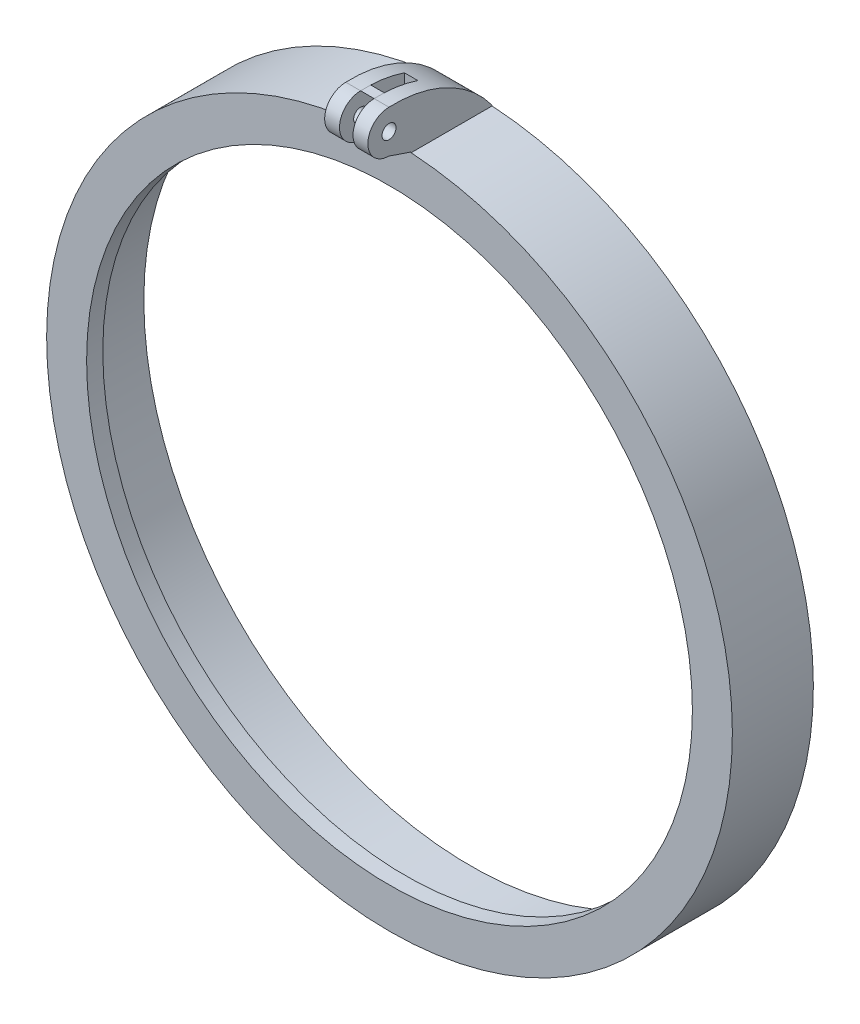
ISO-10303-21;
HEADER;
FILE_DESCRIPTION(('STEP AP214'),'2;1');
FILE_NAME('part.step','',(''),(''),'','','');
FILE_SCHEMA(('AUTOMOTIVE_DESIGN { 1 0 10303 214 1 1 1 1 }'));
ENDSEC;
DATA;
#1=APPLICATION_CONTEXT('core data for automotive mechanical design processes');
#2=APPLICATION_PROTOCOL_DEFINITION('international standard','automotive_design',2000,#1);
#3=PRODUCT_CONTEXT('',#1,'mechanical');
#4=PRODUCT('Part','Part','',(#3));
#5=PRODUCT_RELATED_PRODUCT_CATEGORY('part','',(#4));
#6=PRODUCT_DEFINITION_FORMATION('','',#4);
#7=PRODUCT_DEFINITION_CONTEXT('part definition',#1,'design');
#8=PRODUCT_DEFINITION('design','',#6,#7);
#9=PRODUCT_DEFINITION_SHAPE('','',#8);
#10=(LENGTH_UNIT() NAMED_UNIT(*) SI_UNIT(.MILLI.,.METRE.));
#11=(NAMED_UNIT(*) PLANE_ANGLE_UNIT() SI_UNIT($,.RADIAN.));
#12=(NAMED_UNIT(*) SI_UNIT($,.STERADIAN.) SOLID_ANGLE_UNIT());
#13=UNCERTAINTY_MEASURE_WITH_UNIT(LENGTH_MEASURE(1.E-05),#10,'distance_accuracy_value','');
#14=(GEOMETRIC_REPRESENTATION_CONTEXT(3) GLOBAL_UNCERTAINTY_ASSIGNED_CONTEXT((#13)) GLOBAL_UNIT_ASSIGNED_CONTEXT((#10,
#11,#12)) REPRESENTATION_CONTEXT('',''));
#15=CARTESIAN_POINT('',(0.,0.,0.));
#16=DIRECTION('',(0.,0.,1.));
#17=DIRECTION('',(1.,0.,0.));
#18=AXIS2_PLACEMENT_3D('',#15,#16,#17);
#19=CARTESIAN_POINT('',(-3.99999999999999,229.185888223784,-39.1843939049819));
#20=DIRECTION('',(1.,0.,0.));
#21=DIRECTION('',(0.,0.,-1.));
#22=AXIS2_PLACEMENT_3D('',#19,#20,#21);
#23=CYLINDRICAL_SURFACE('',#22,174.320859622004);
#24=CARTESIAN_POINT('',(-1.24999999999999,229.185888223784,-39.1843939049819));
#25=DIRECTION('',(-1.,0.,0.));
#26=DIRECTION('',(0.,0.,1.));
#27=AXIS2_PLACEMENT_3D('',#24,#25,#26);
#28=CIRCLE('',#27,174.320859622004);
#29=CARTESIAN_POINT('',(-1.24999999999999,64.8948795862415,19.0927592531248));
#30=VERTEX_POINT('',#29);
#31=CARTESIAN_POINT('',(-1.24999999999999,63.5,15.));
#32=VERTEX_POINT('',#31);
#33=EDGE_CURVE('E142',#30,#32,#28,.F.);
#34=ORIENTED_EDGE('',*,*,#33,.F.);
#35=DIRECTION('',(1.,0.,0.));
#36=VECTOR('',#35,1.);
#37=CARTESIAN_POINT('',(-3.99999999999999,64.8948795862415,19.0927592531248));
#38=LINE('',#37,#36);
#39=CARTESIAN_POINT('',(-3.99999999999999,64.8948795862415,19.0927592531248));
#40=VERTEX_POINT('',#39);
#41=EDGE_CURVE('E230',#40,#30,#38,.T.);
#42=ORIENTED_EDGE('',*,*,#41,.F.);
#43=CARTESIAN_POINT('',(-3.99999999999999,229.185888223784,-39.1843939049819));
#44=DIRECTION('',(1.,0.,0.));
#45=DIRECTION('',(0.,0.,-1.));
#46=AXIS2_PLACEMENT_3D('',#43,#44,#45);
#47=CIRCLE('',#46,174.320859622004);
#48=CARTESIAN_POINT('',(-3.99999999999999,63.5,15.));
#49=VERTEX_POINT('',#48);
#50=EDGE_CURVE('E225',#40,#49,#47,.T.);
#51=ORIENTED_EDGE('',*,*,#50,.T.);
#52=DIRECTION('',(-1.,0.,0.));
#53=VECTOR('',#52,1.);
#54=CARTESIAN_POINT('',(-3.99999999999999,63.5,15.));
#55=LINE('',#54,#53);
#56=EDGE_CURVE('E249',#32,#49,#55,.T.);
#57=ORIENTED_EDGE('',*,*,#56,.F.);
#58=EDGE_LOOP('',(#34,#42,#51,#57));
#59=FACE_BOUND('',#58,.T.);
#60=ADVANCED_FACE('F38',(#59),#23,.T.);
#61=CARTESIAN_POINT('',(-3.99999999999999,68.8116804407337,19.0927592531248));
#62=DIRECTION('',(1.,0.,0.));
#63=DIRECTION('',(0.,0.,-1.));
#64=AXIS2_PLACEMENT_3D('',#61,#62,#63);
#65=CYLINDRICAL_SURFACE('',#64,3.91680085449216);
#66=CARTESIAN_POINT('',(-1.24999999999999,68.8116804407337,19.0927592531248));
#67=DIRECTION('',(-1.,0.,0.));
#68=DIRECTION('',(0.,0.,1.));
#69=AXIS2_PLACEMENT_3D('',#66,#67,#68);
#70=CIRCLE('',#69,3.91680085449216);
#71=CARTESIAN_POINT('',(-1.24999999999999,72.7284812952258,19.0927592531248));
#72=VERTEX_POINT('',#71);
#73=EDGE_CURVE('E174',#72,#30,#70,.F.);
#74=ORIENTED_EDGE('',*,*,#73,.F.);
#75=DIRECTION('',(1.,0.,0.));
#76=VECTOR('',#75,1.);
#77=CARTESIAN_POINT('',(-3.99999999999999,72.7284812952258,19.0927592531248));
#78=LINE('',#77,#76);
#79=CARTESIAN_POINT('',(-3.99999999999999,72.7284812952258,19.0927592531248));
#80=VERTEX_POINT('',#79);
#81=EDGE_CURVE('E236',#80,#72,#78,.T.);
#82=ORIENTED_EDGE('',*,*,#81,.F.);
#83=CARTESIAN_POINT('',(-3.99999999999999,68.8116804407337,19.0927592531248));
#84=DIRECTION('',(1.,0.,0.));
#85=DIRECTION('',(0.,0.,-1.));
#86=AXIS2_PLACEMENT_3D('',#83,#84,#85);
#87=CIRCLE('',#86,3.91680085449216);
#88=EDGE_CURVE('E221',#80,#40,#87,.T.);
#89=ORIENTED_EDGE('',*,*,#88,.T.);
#90=ORIENTED_EDGE('',*,*,#41,.T.);
#91=EDGE_LOOP('',(#74,#82,#89,#90));
#92=FACE_BOUND('',#91,.T.);
#93=ADVANCED_FACE('F308',(#92),#65,.T.);
#94=CARTESIAN_POINT('',(-3.99999999999999,68.8116804407337,19.0927592531248));
#95=DIRECTION('',(1.,0.,0.));
#96=DIRECTION('',(0.,0.,-1.));
#97=AXIS2_PLACEMENT_3D('',#94,#95,#96);
#98=CYLINDRICAL_SURFACE('',#97,1.3);
#99=CARTESIAN_POINT('',(-1.24999999999999,68.8116804407337,19.0927592531248));
#100=DIRECTION('',(-1.,0.,0.));
#101=DIRECTION('',(0.,0.,1.));
#102=AXIS2_PLACEMENT_3D('',#99,#100,#101);
#103=CIRCLE('',#102,1.3);
#104=CARTESIAN_POINT('',(-1.24999999999999,68.8116804407337,20.3927592531248));
#105=VERTEX_POINT('',#104);
#106=EDGE_CURVE('E173',#105,#105,#103,.F.);
#107=ORIENTED_EDGE('',*,*,#106,.T.);
#108=EDGE_LOOP('',(#107));
#109=FACE_BOUND('',#108,.T.);
#110=CARTESIAN_POINT('',(-3.99999999999999,68.8116804407337,19.0927592531248));
#111=DIRECTION('',(1.,0.,0.));
#112=DIRECTION('',(0.,0.,-1.));
#113=AXIS2_PLACEMENT_3D('',#110,#111,#112);
#114=CIRCLE('',#113,1.3);
#115=CARTESIAN_POINT('',(-3.99999999999999,68.8116804407337,17.7927592531248));
#116=VERTEX_POINT('',#115);
#117=EDGE_CURVE('E213',#116,#116,#114,.T.);
#118=ORIENTED_EDGE('',*,*,#117,.F.);
#119=EDGE_LOOP('',(#118));
#120=FACE_BOUND('',#119,.T.);
#121=ADVANCED_FACE('F290',(#109,#120),#98,.F.);
#122=CARTESIAN_POINT('',(0.,0.,15.));
#123=DIRECTION('',(0.,0.,-1.));
#124=DIRECTION('',(-1.,0.,0.));
#125=AXIS2_PLACEMENT_3D('',#122,#123,#124);
#126=CYLINDRICAL_SURFACE('',#125,63.5);
#127=DIRECTION('',(0.,0.,-1.));
#128=VECTOR('',#127,1.);
#129=CARTESIAN_POINT('',(3.99999999999999,63.3738905228328,15.));
#130=LINE('',#129,#128);
#131=CARTESIAN_POINT('',(3.99999999999999,63.3738905228328,0.));
#132=VERTEX_POINT('',#131);
#133=CARTESIAN_POINT('',(3.99999999999999,63.3738905228328,15.));
#134=VERTEX_POINT('',#133);
#135=EDGE_CURVE('E186',#132,#134,#130,.F.);
#136=ORIENTED_EDGE('',*,*,#135,.T.);
#137=CARTESIAN_POINT('',(0.,0.,15.));
#138=DIRECTION('',(0.,0.,1.));
#139=DIRECTION('',(1.,0.,0.));
#140=AXIS2_PLACEMENT_3D('',#137,#138,#139);
#141=CIRCLE('',#140,63.5);
#142=CARTESIAN_POINT('',(-3.99999999999999,63.3738905228328,15.));
#143=VERTEX_POINT('',#142);
#144=EDGE_CURVE('E47',#143,#134,#141,.T.);
#145=ORIENTED_EDGE('',*,*,#144,.F.);
#146=DIRECTION('',(0.,0.,-1.));
#147=VECTOR('',#146,1.);
#148=CARTESIAN_POINT('',(-3.99999999999999,63.3738905228328,15.));
#149=LINE('',#148,#147);
#150=CARTESIAN_POINT('',(-3.99999999999999,63.3738905228328,0.));
#151=VERTEX_POINT('',#150);
#152=EDGE_CURVE('E241',#143,#151,#149,.T.);
#153=ORIENTED_EDGE('',*,*,#152,.T.);
#154=CARTESIAN_POINT('',(0.,0.,0.));
#155=DIRECTION('',(0.,0.,1.));
#156=DIRECTION('',(1.,0.,0.));
#157=AXIS2_PLACEMENT_3D('',#154,#155,#156);
#158=CIRCLE('',#157,63.5);
#159=EDGE_CURVE('E270',#151,#132,#158,.T.);
#160=ORIENTED_EDGE('',*,*,#159,.T.);
#161=EDGE_LOOP('',(#136,#145,#153,#160));
#162=FACE_BOUND('',#161,.T.);
#163=ADVANCED_FACE('F40',(#162),#126,.T.);
#164=CARTESIAN_POINT('',(0.,0.,15.));
#165=DIRECTION('',(0.,0.,1.));
#166=DIRECTION('',(1.,0.,0.));
#167=AXIS2_PLACEMENT_3D('',#164,#165,#166);
#168=PLANE('',#167);
#169=CARTESIAN_POINT('',(0.,0.,15.));
#170=DIRECTION('',(0.,0.,1.));
#171=DIRECTION('',(1.,0.,0.));
#172=AXIS2_PLACEMENT_3D('',#169,#170,#171);
#173=CIRCLE('',#172,56.097029569979);
#174=CARTESIAN_POINT('',(56.097029569979,0.,15.));
#175=VERTEX_POINT('',#174);
#176=EDGE_CURVE('E265',#175,#175,#173,.T.);
#177=ORIENTED_EDGE('',*,*,#176,.F.);
#178=EDGE_LOOP('',(#177));
#179=FACE_BOUND('',#178,.T.);
#180=ORIENTED_EDGE('',*,*,#144,.T.);
#181=DIRECTION('',(0.,1.,0.));
#182=VECTOR('',#181,1.);
#183=CARTESIAN_POINT('',(3.99999999999999,-63.501,15.));
#184=LINE('',#183,#182);
#185=CARTESIAN_POINT('',(3.99999999999999,63.5,15.));
#186=VERTEX_POINT('',#185);
#187=EDGE_CURVE('E185',#134,#186,#184,.T.);
#188=ORIENTED_EDGE('',*,*,#187,.T.);
#189=CARTESIAN_POINT('',(1.25000000000001,63.5,15.));
#190=VERTEX_POINT('',#189);
#191=EDGE_CURVE('E250',#186,#190,#55,.T.);
#192=ORIENTED_EDGE('',*,*,#191,.T.);
#193=EDGE_CURVE('E255',#190,#32,#55,.T.);
#194=ORIENTED_EDGE('',*,*,#193,.T.);
#195=ORIENTED_EDGE('',*,*,#56,.T.);
#196=DIRECTION('',(0.,1.,0.));
#197=VECTOR('',#196,1.);
#198=CARTESIAN_POINT('',(-3.99999999999999,-63.501,15.));
#199=LINE('',#198,#197);
#200=EDGE_CURVE('E254',#143,#49,#199,.T.);
#201=ORIENTED_EDGE('',*,*,#200,.F.);
#202=EDGE_LOOP('',(#180,#188,#192,#194,#195,#201));
#203=FACE_BOUND('',#202,.T.);
#204=ADVANCED_FACE('F335',(#179,#203),#168,.T.);
#205=CARTESIAN_POINT('',(0.,0.,0.));
#206=DIRECTION('',(0.,0.,1.));
#207=DIRECTION('',(1.,0.,0.));
#208=AXIS2_PLACEMENT_3D('',#205,#206,#207);
#209=PLANE('',#208);
#210=CARTESIAN_POINT('',(0.,0.,0.));
#211=DIRECTION('',(0.,0.,1.));
#212=DIRECTION('',(1.,0.,0.));
#213=AXIS2_PLACEMENT_3D('',#210,#211,#212);
#214=CIRCLE('',#213,60.5);
#215=CARTESIAN_POINT('',(60.5,0.,0.));
#216=VERTEX_POINT('',#215);
#217=EDGE_CURVE('E271',#216,#216,#214,.T.);
#218=ORIENTED_EDGE('',*,*,#217,.T.);
#219=EDGE_LOOP('',(#218));
#220=FACE_BOUND('',#219,.T.);
#221=ORIENTED_EDGE('',*,*,#159,.F.);
#222=DIRECTION('',(0.,1.,0.));
#223=VECTOR('',#222,1.);
#224=CARTESIAN_POINT('',(-3.99999999999999,-63.501,0.));
#225=LINE('',#224,#223);
#226=CARTESIAN_POINT('',(-3.99999999999999,63.5,0.));
#227=VERTEX_POINT('',#226);
#228=EDGE_CURVE('E246',#151,#227,#225,.T.);
#229=ORIENTED_EDGE('',*,*,#228,.T.);
#230=DIRECTION('',(1.,0.,0.));
#231=VECTOR('',#230,1.);
#232=CARTESIAN_POINT('',(-3.99999999999999,63.5,0.));
#233=LINE('',#232,#231);
#234=CARTESIAN_POINT('',(3.99999999999999,63.5,0.));
#235=VERTEX_POINT('',#234);
#236=EDGE_CURVE('E234',#227,#235,#233,.T.);
#237=ORIENTED_EDGE('',*,*,#236,.T.);
#238=DIRECTION('',(0.,1.,0.));
#239=VECTOR('',#238,1.);
#240=CARTESIAN_POINT('',(3.99999999999999,-63.501,0.));
#241=LINE('',#240,#239);
#242=EDGE_CURVE('E191',#132,#235,#241,.T.);
#243=ORIENTED_EDGE('',*,*,#242,.F.);
#244=EDGE_LOOP('',(#221,#229,#237,#243));
#245=FACE_BOUND('',#244,.T.);
#246=ADVANCED_FACE('F363',(#220,#245),#209,.F.);
#247=CARTESIAN_POINT('',(0.,0.,15.));
#248=DIRECTION('',(0.,0.,-1.));
#249=DIRECTION('',(-1.,0.,0.));
#250=AXIS2_PLACEMENT_3D('',#247,#248,#249);
#251=CYLINDRICAL_SURFACE('',#250,60.5);
#252=CARTESIAN_POINT('',(0.,0.,12.));
#253=DIRECTION('',(0.,0.,1.));
#254=DIRECTION('',(1.,0.,0.));
#255=AXIS2_PLACEMENT_3D('',#252,#253,#254);
#256=CIRCLE('',#255,60.5);
#257=CARTESIAN_POINT('',(60.5,0.,12.));
#258=VERTEX_POINT('',#257);
#259=EDGE_CURVE('E266',#258,#258,#256,.T.);
#260=ORIENTED_EDGE('',*,*,#259,.T.);
#261=EDGE_LOOP('',(#260));
#262=FACE_BOUND('',#261,.T.);
#263=ORIENTED_EDGE('',*,*,#217,.F.);
#264=EDGE_LOOP('',(#263));
#265=FACE_BOUND('',#264,.T.);
#266=ADVANCED_FACE('F365',(#262,#265),#251,.F.);
#267=CARTESIAN_POINT('',(0.,0.,12.));
#268=DIRECTION('',(0.,0.,1.));
#269=DIRECTION('',(1.,0.,0.));
#270=AXIS2_PLACEMENT_3D('',#267,#268,#269);
#271=PLANE('',#270);
#272=CARTESIAN_POINT('',(0.,0.,12.));
#273=DIRECTION('',(0.,0.,-1.));
#274=DIRECTION('',(-1.,0.,0.));
#275=AXIS2_PLACEMENT_3D('',#272,#273,#274);
#276=CIRCLE('',#275,56.097029569979);
#277=CARTESIAN_POINT('',(-56.097029569979,0.,12.));
#278=VERTEX_POINT('',#277);
#279=EDGE_CURVE('E245',#278,#278,#276,.T.);
#280=ORIENTED_EDGE('',*,*,#279,.F.);
#281=EDGE_LOOP('',(#280));
#282=FACE_BOUND('',#281,.T.);
#283=ORIENTED_EDGE('',*,*,#259,.F.);
#284=EDGE_LOOP('',(#283));
#285=FACE_BOUND('',#284,.T.);
#286=ADVANCED_FACE('F371',(#282,#285),#271,.F.);
#287=CARTESIAN_POINT('',(0.,0.,34.));
#288=DIRECTION('',(0.,0.,-1.));
#289=DIRECTION('',(-1.,0.,0.));
#290=AXIS2_PLACEMENT_3D('',#287,#288,#289);
#291=CYLINDRICAL_SURFACE('',#290,56.097029569979);
#292=ORIENTED_EDGE('',*,*,#176,.T.);
#293=EDGE_LOOP('',(#292));
#294=FACE_BOUND('',#293,.T.);
#295=ORIENTED_EDGE('',*,*,#279,.T.);
#296=EDGE_LOOP('',(#295));
#297=FACE_BOUND('',#296,.T.);
#298=ADVANCED_FACE('F379',(#294,#297),#291,.F.);
#299=CARTESIAN_POINT('',(-3.99999999999999,-63.501,15.));
#300=DIRECTION('',(1.,0.,0.));
#301=DIRECTION('',(0.,0.,-1.));
#302=AXIS2_PLACEMENT_3D('',#299,#300,#301);
#303=PLANE('',#302);
#304=ORIENTED_EDGE('',*,*,#152,.F.);
#305=ORIENTED_EDGE('',*,*,#200,.T.);
#306=ORIENTED_EDGE('',*,*,#50,.F.);
#307=ORIENTED_EDGE('',*,*,#88,.F.);
#308=CARTESIAN_POINT('',(-3.99999999999999,50.2901693666308,18.1616408489232));
#309=DIRECTION('',(1.,0.,0.));
#310=DIRECTION('',(0.,0.,1.));
#311=AXIS2_PLACEMENT_3D('',#308,#309,#310);
#312=CIRCLE('',#311,22.4576228414223);
#313=EDGE_CURVE('E217',#227,#80,#312,.T.);
#314=ORIENTED_EDGE('',*,*,#313,.F.);
#315=ORIENTED_EDGE('',*,*,#228,.F.);
#316=EDGE_LOOP('',(#304,#305,#306,#307,#314,#315));
#317=FACE_BOUND('',#316,.T.);
#318=ORIENTED_EDGE('',*,*,#117,.T.);
#319=EDGE_LOOP('',(#318));
#320=FACE_BOUND('',#319,.T.);
#321=ADVANCED_FACE('F328',(#317,#320),#303,.F.);
#322=CARTESIAN_POINT('',(-3.99999999999999,50.2901693666308,18.1616408489232));
#323=DIRECTION('',(1.,0.,0.));
#324=DIRECTION('',(0.,0.,-1.));
#325=AXIS2_PLACEMENT_3D('',#322,#323,#324);
#326=CYLINDRICAL_SURFACE('',#325,22.4576228414223);
#327=CARTESIAN_POINT('',(-1.24999999999999,50.2901693666308,18.1616408489232));
#328=DIRECTION('',(-1.,0.,0.));
#329=DIRECTION('',(0.,0.,1.));
#330=AXIS2_PLACEMENT_3D('',#327,#328,#329);
#331=CIRCLE('',#330,22.4576228414223);
#332=CARTESIAN_POINT('',(-1.24999999999999,71.5752750520299,11.));
#333=VERTEX_POINT('',#332);
#334=CARTESIAN_POINT('',(-1.24999999999999,72.7284812952258,17.2305224447215));
#335=VERTEX_POINT('',#334);
#336=EDGE_CURVE('E179',#333,#335,#331,.F.);
#337=ORIENTED_EDGE('',*,*,#336,.F.);
#338=DIRECTION('',(1.,0.,0.));
#339=VECTOR('',#338,1.);
#340=CARTESIAN_POINT('',(-3.99999999999999,71.5752750520299,11.));
#341=LINE('',#340,#339);
#342=CARTESIAN_POINT('',(1.25000000000001,71.5752750520299,11.));
#343=VERTEX_POINT('',#342);
#344=EDGE_CURVE('E11',#343,#333,#341,.F.);
#345=ORIENTED_EDGE('',*,*,#344,.F.);
#346=CARTESIAN_POINT('',(1.25000000000001,50.2901693666308,18.1616408489232));
#347=DIRECTION('',(1.,0.,0.));
#348=DIRECTION('',(0.,0.,-1.));
#349=AXIS2_PLACEMENT_3D('',#346,#347,#348);
#350=CIRCLE('',#349,22.4576228414223);
#351=CARTESIAN_POINT('',(1.25000000000001,72.7284812952258,17.2305224447215));
#352=VERTEX_POINT('',#351);
#353=EDGE_CURVE('E170',#352,#343,#350,.F.);
#354=ORIENTED_EDGE('',*,*,#353,.F.);
#355=DIRECTION('',(1.,0.,0.));
#356=VECTOR('',#355,1.);
#357=CARTESIAN_POINT('',(-3.99999999999999,72.7284812952258,17.2305224447215));
#358=LINE('',#357,#356);
#359=EDGE_CURVE('E182',#335,#352,#358,.T.);
#360=ORIENTED_EDGE('',*,*,#359,.F.);
#361=EDGE_LOOP('',(#337,#345,#354,#360));
#362=FACE_BOUND('',#361,.T.);
#363=ORIENTED_EDGE('',*,*,#81,.T.);
#364=CARTESIAN_POINT('',(1.25000000000001,72.7284812952258,19.0927592531248));
#365=VERTEX_POINT('',#364);
#366=EDGE_CURVE('E240',#72,#365,#78,.T.);
#367=ORIENTED_EDGE('',*,*,#366,.T.);
#368=CARTESIAN_POINT('',(3.99999999999999,72.7284812952258,19.0927592531248));
#369=VERTEX_POINT('',#368);
#370=EDGE_CURVE('E229',#365,#369,#78,.T.);
#371=ORIENTED_EDGE('',*,*,#370,.T.);
#372=CARTESIAN_POINT('',(3.99999999999999,50.2901693666308,18.1616408489232));
#373=DIRECTION('',(1.,0.,0.));
#374=DIRECTION('',(0.,0.,1.));
#375=AXIS2_PLACEMENT_3D('',#372,#373,#374);
#376=CIRCLE('',#375,22.4576228414223);
#377=EDGE_CURVE('E201',#235,#369,#376,.T.);
#378=ORIENTED_EDGE('',*,*,#377,.F.);
#379=ORIENTED_EDGE('',*,*,#236,.F.);
#380=ORIENTED_EDGE('',*,*,#313,.T.);
#381=EDGE_LOOP('',(#363,#367,#371,#378,#379,#380));
#382=FACE_BOUND('',#381,.T.);
#383=ADVANCED_FACE('F321',(#362,#382),#326,.T.);
#384=CARTESIAN_POINT('',(1.25000000000001,229.185888223784,-39.1843939049819));
#385=DIRECTION('',(1.,0.,0.));
#386=DIRECTION('',(0.,0.,-1.));
#387=AXIS2_PLACEMENT_3D('',#384,#385,#386);
#388=CIRCLE('',#387,174.320859622004);
#389=CARTESIAN_POINT('',(1.25000000000001,64.8948795862415,19.0927592531248));
#390=VERTEX_POINT('',#389);
#391=EDGE_CURVE('E61',#190,#390,#388,.F.);
#392=ORIENTED_EDGE('',*,*,#391,.F.);
#393=ORIENTED_EDGE('',*,*,#191,.F.);
#394=CARTESIAN_POINT('',(3.99999999999999,229.185888223784,-39.1843939049819));
#395=DIRECTION('',(1.,0.,0.));
#396=DIRECTION('',(0.,0.,-1.));
#397=AXIS2_PLACEMENT_3D('',#394,#395,#396);
#398=CIRCLE('',#397,174.320859622004);
#399=CARTESIAN_POINT('',(3.99999999999999,64.8948795862415,19.0927592531248));
#400=VERTEX_POINT('',#399);
#401=EDGE_CURVE('E209',#400,#186,#398,.T.);
#402=ORIENTED_EDGE('',*,*,#401,.F.);
#403=EDGE_CURVE('E235',#390,#400,#38,.T.);
#404=ORIENTED_EDGE('',*,*,#403,.F.);
#405=EDGE_LOOP('',(#392,#393,#402,#404));
#406=FACE_BOUND('',#405,.T.);
#407=ADVANCED_FACE('F311',(#406),#23,.T.);
#408=CARTESIAN_POINT('',(1.25000000000001,68.8116804407337,19.0927592531248));
#409=DIRECTION('',(1.,0.,0.));
#410=DIRECTION('',(0.,0.,-1.));
#411=AXIS2_PLACEMENT_3D('',#408,#409,#410);
#412=CIRCLE('',#411,3.91680085449216);
#413=EDGE_CURVE('E165',#390,#365,#412,.F.);
#414=ORIENTED_EDGE('',*,*,#413,.F.);
#415=ORIENTED_EDGE('',*,*,#403,.T.);
#416=CARTESIAN_POINT('',(3.99999999999999,68.8116804407337,19.0927592531248));
#417=DIRECTION('',(1.,0.,0.));
#418=DIRECTION('',(0.,0.,-1.));
#419=AXIS2_PLACEMENT_3D('',#416,#417,#418);
#420=CIRCLE('',#419,3.91680085449216);
#421=EDGE_CURVE('E205',#369,#400,#420,.T.);
#422=ORIENTED_EDGE('',*,*,#421,.F.);
#423=ORIENTED_EDGE('',*,*,#370,.F.);
#424=EDGE_LOOP('',(#414,#415,#422,#423));
#425=FACE_BOUND('',#424,.T.);
#426=ADVANCED_FACE('F318',(#425),#65,.T.);
#427=CARTESIAN_POINT('',(1.25000000000001,68.8116804407337,19.0927592531248));
#428=DIRECTION('',(1.,0.,0.));
#429=DIRECTION('',(0.,0.,-1.));
#430=AXIS2_PLACEMENT_3D('',#427,#428,#429);
#431=CIRCLE('',#430,1.3);
#432=CARTESIAN_POINT('',(1.25000000000001,68.8116804407337,17.7927592531248));
#433=VERTEX_POINT('',#432);
#434=EDGE_CURVE('E158',#433,#433,#431,.F.);
#435=ORIENTED_EDGE('',*,*,#434,.T.);
#436=EDGE_LOOP('',(#435));
#437=FACE_BOUND('',#436,.T.);
#438=CARTESIAN_POINT('',(3.99999999999999,68.8116804407337,19.0927592531248));
#439=DIRECTION('',(1.,0.,0.));
#440=DIRECTION('',(0.,0.,-1.));
#441=AXIS2_PLACEMENT_3D('',#438,#439,#440);
#442=CIRCLE('',#441,1.3);
#443=CARTESIAN_POINT('',(3.99999999999999,68.8116804407337,17.7927592531248));
#444=VERTEX_POINT('',#443);
#445=EDGE_CURVE('E190',#444,#444,#442,.T.);
#446=ORIENTED_EDGE('',*,*,#445,.T.);
#447=EDGE_LOOP('',(#446));
#448=FACE_BOUND('',#447,.T.);
#449=ADVANCED_FACE('F303',(#437,#448),#98,.F.);
#450=CARTESIAN_POINT('',(3.99999999999999,50.2901693666308,18.1616408489232));
#451=DIRECTION('',(-1.,0.,0.));
#452=DIRECTION('',(0.,0.,1.));
#453=AXIS2_PLACEMENT_3D('',#450,#451,#452);
#454=PLANE('',#453);
#455=ORIENTED_EDGE('',*,*,#377,.T.);
#456=ORIENTED_EDGE('',*,*,#421,.T.);
#457=ORIENTED_EDGE('',*,*,#401,.T.);
#458=ORIENTED_EDGE('',*,*,#187,.F.);
#459=ORIENTED_EDGE('',*,*,#135,.F.);
#460=ORIENTED_EDGE('',*,*,#242,.T.);
#461=EDGE_LOOP('',(#455,#456,#457,#458,#459,#460));
#462=FACE_BOUND('',#461,.T.);
#463=ORIENTED_EDGE('',*,*,#445,.F.);
#464=EDGE_LOOP('',(#463));
#465=FACE_BOUND('',#464,.T.);
#466=ADVANCED_FACE('F294',(#462,#465),#454,.F.);
#467=CARTESIAN_POINT('',(-1.24999999999999,63.5,11.));
#468=DIRECTION('',(-1.,0.,0.));
#469=DIRECTION('',(0.,0.,1.));
#470=AXIS2_PLACEMENT_3D('',#467,#468,#469);
#471=PLANE('',#470);
#472=ORIENTED_EDGE('',*,*,#336,.T.);
#473=DIRECTION('',(0.,0.,1.));
#474=VECTOR('',#473,1.);
#475=CARTESIAN_POINT('',(-1.24999999999999,72.7284812952258,11.));
#476=LINE('',#475,#474);
#477=EDGE_CURVE('E154',#335,#72,#476,.T.);
#478=ORIENTED_EDGE('',*,*,#477,.T.);
#479=ORIENTED_EDGE('',*,*,#73,.T.);
#480=ORIENTED_EDGE('',*,*,#33,.T.);
#481=DIRECTION('',(0.,0.,1.));
#482=VECTOR('',#481,1.);
#483=CARTESIAN_POINT('',(-1.24999999999999,63.5,11.));
#484=LINE('',#483,#482);
#485=CARTESIAN_POINT('',(-1.24999999999999,63.5,11.));
#486=VERTEX_POINT('',#485);
#487=EDGE_CURVE('E138',#486,#32,#484,.T.);
#488=ORIENTED_EDGE('',*,*,#487,.F.);
#489=DIRECTION('',(0.,-1.,0.));
#490=VECTOR('',#489,1.);
#491=CARTESIAN_POINT('',(-1.24999999999999,63.5,11.));
#492=LINE('',#491,#490);
#493=EDGE_CURVE('E127',#333,#486,#492,.T.);
#494=ORIENTED_EDGE('',*,*,#493,.F.);
#495=EDGE_LOOP('',(#472,#478,#479,#480,#488,#494));
#496=FACE_BOUND('',#495,.T.);
#497=ORIENTED_EDGE('',*,*,#106,.F.);
#498=EDGE_LOOP('',(#497));
#499=FACE_BOUND('',#498,.T.);
#500=ADVANCED_FACE('F139',(#496,#499),#471,.F.);
#501=CARTESIAN_POINT('',(1.25000000000001,63.5,11.));
#502=DIRECTION('',(1.,0.,0.));
#503=DIRECTION('',(0.,0.,-1.));
#504=AXIS2_PLACEMENT_3D('',#501,#502,#503);
#505=PLANE('',#504);
#506=ORIENTED_EDGE('',*,*,#353,.T.);
#507=DIRECTION('',(0.,1.,0.));
#508=VECTOR('',#507,1.);
#509=CARTESIAN_POINT('',(1.25000000000001,63.5,11.));
#510=LINE('',#509,#508);
#511=CARTESIAN_POINT('',(1.25000000000001,63.5,11.));
#512=VERTEX_POINT('',#511);
#513=EDGE_CURVE('E53',#512,#343,#510,.T.);
#514=ORIENTED_EDGE('',*,*,#513,.F.);
#515=DIRECTION('',(0.,0.,1.));
#516=VECTOR('',#515,1.);
#517=CARTESIAN_POINT('',(1.25000000000001,63.5,11.));
#518=LINE('',#517,#516);
#519=EDGE_CURVE('E146',#512,#190,#518,.T.);
#520=ORIENTED_EDGE('',*,*,#519,.T.);
#521=ORIENTED_EDGE('',*,*,#391,.T.);
#522=ORIENTED_EDGE('',*,*,#413,.T.);
#523=DIRECTION('',(0.,0.,1.));
#524=VECTOR('',#523,1.);
#525=CARTESIAN_POINT('',(1.25000000000001,72.7284812952258,11.));
#526=LINE('',#525,#524);
#527=EDGE_CURVE('E159',#352,#365,#526,.T.);
#528=ORIENTED_EDGE('',*,*,#527,.F.);
#529=EDGE_LOOP('',(#506,#514,#520,#521,#522,#528));
#530=FACE_BOUND('',#529,.T.);
#531=ORIENTED_EDGE('',*,*,#434,.F.);
#532=EDGE_LOOP('',(#531));
#533=FACE_BOUND('',#532,.T.);
#534=ADVANCED_FACE('F293',(#530,#533),#505,.F.);
#535=CARTESIAN_POINT('',(-1.24999999999999,72.7284812952258,11.));
#536=DIRECTION('',(0.,1.,0.));
#537=DIRECTION('',(0.,0.,1.));
#538=AXIS2_PLACEMENT_3D('',#535,#536,#537);
#539=PLANE('',#538);
#540=ORIENTED_EDGE('',*,*,#359,.T.);
#541=ORIENTED_EDGE('',*,*,#527,.T.);
#542=ORIENTED_EDGE('',*,*,#366,.F.);
#543=ORIENTED_EDGE('',*,*,#477,.F.);
#544=EDGE_LOOP('',(#540,#541,#542,#543));
#545=FACE_BOUND('',#544,.T.);
#546=ADVANCED_FACE('F300',(#545),#539,.F.);
#547=CARTESIAN_POINT('',(-1.24999999999999,63.5,11.));
#548=DIRECTION('',(0.,-1.,0.));
#549=DIRECTION('',(0.,0.,-1.));
#550=AXIS2_PLACEMENT_3D('',#547,#548,#549);
#551=PLANE('',#550);
#552=ORIENTED_EDGE('',*,*,#193,.F.);
#553=ORIENTED_EDGE('',*,*,#519,.F.);
#554=DIRECTION('',(1.,0.,0.));
#555=VECTOR('',#554,1.);
#556=CARTESIAN_POINT('',(-1.24999999999999,63.5,11.));
#557=LINE('',#556,#555);
#558=EDGE_CURVE('E131',#486,#512,#557,.T.);
#559=ORIENTED_EDGE('',*,*,#558,.F.);
#560=ORIENTED_EDGE('',*,*,#487,.T.);
#561=EDGE_LOOP('',(#552,#553,#559,#560));
#562=FACE_BOUND('',#561,.T.);
#563=ADVANCED_FACE('F148',(#562),#551,.F.);
#564=CARTESIAN_POINT('',(0.,0.,11.));
#565=DIRECTION('',(0.,0.,-1.));
#566=DIRECTION('',(-1.,0.,0.));
#567=AXIS2_PLACEMENT_3D('',#564,#565,#566);
#568=PLANE('',#567);
#569=ORIENTED_EDGE('',*,*,#344,.T.);
#570=ORIENTED_EDGE('',*,*,#493,.T.);
#571=ORIENTED_EDGE('',*,*,#558,.T.);
#572=ORIENTED_EDGE('',*,*,#513,.T.);
#573=EDGE_LOOP('',(#569,#570,#571,#572));
#574=FACE_BOUND('',#573,.T.);
#575=ADVANCED_FACE('F129',(#574),#568,.F.);
#576=CLOSED_SHELL('',(#60,#93,#121,#163,#204,#246,#266,#286,#298,#321,#383,#407,#426,#449,#466,
#500,#534,#546,#563,#575));
#577=MANIFOLD_SOLID_BREP('B2',#576);
#578=ADVANCED_BREP_SHAPE_REPRESENTATION('',(#18,#577),#14);
#579=SHAPE_DEFINITION_REPRESENTATION(#9,#578);
ENDSEC;
END-ISO-10303-21;
